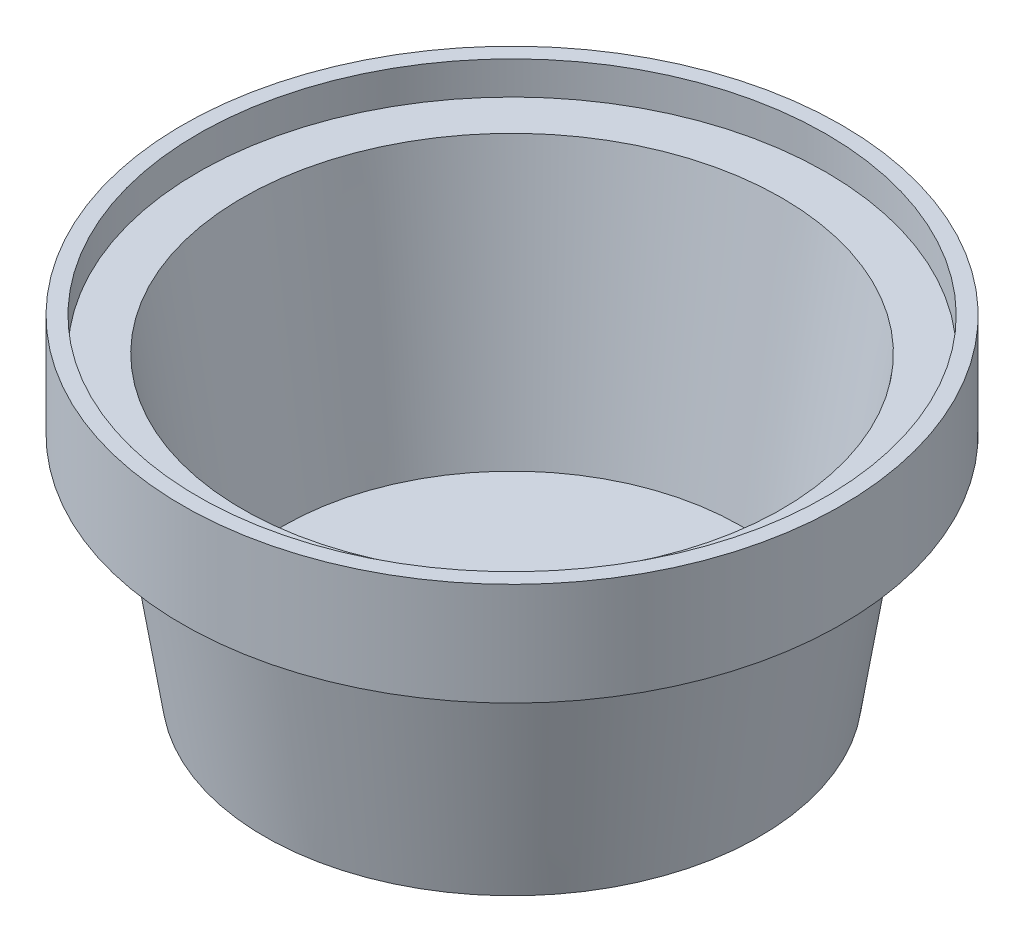
ISO-10303-21;
HEADER;
FILE_DESCRIPTION(('STEP AP214'),'2;1');
FILE_NAME('part.step','',(''),(''),'','','');
FILE_SCHEMA(('AUTOMOTIVE_DESIGN { 1 0 10303 214 1 1 1 1 }'));
ENDSEC;
DATA;
#1=APPLICATION_CONTEXT('core data for automotive mechanical design processes');
#2=APPLICATION_PROTOCOL_DEFINITION('international standard','automotive_design',2000,#1);
#3=PRODUCT_CONTEXT('',#1,'mechanical');
#4=PRODUCT('Part','Part','',(#3));
#5=PRODUCT_RELATED_PRODUCT_CATEGORY('part','',(#4));
#6=PRODUCT_DEFINITION_FORMATION('','',#4);
#7=PRODUCT_DEFINITION_CONTEXT('part definition',#1,'design');
#8=PRODUCT_DEFINITION('design','',#6,#7);
#9=PRODUCT_DEFINITION_SHAPE('','',#8);
#10=(LENGTH_UNIT() NAMED_UNIT(*) SI_UNIT(.MILLI.,.METRE.));
#11=(NAMED_UNIT(*) PLANE_ANGLE_UNIT() SI_UNIT($,.RADIAN.));
#12=(NAMED_UNIT(*) SI_UNIT($,.STERADIAN.) SOLID_ANGLE_UNIT());
#13=UNCERTAINTY_MEASURE_WITH_UNIT(LENGTH_MEASURE(1.E-05),#10,'distance_accuracy_value','');
#14=(GEOMETRIC_REPRESENTATION_CONTEXT(3) GLOBAL_UNCERTAINTY_ASSIGNED_CONTEXT((#13)) GLOBAL_UNIT_ASSIGNED_CONTEXT((#10,
#11,#12)) REPRESENTATION_CONTEXT('',''));
#15=CARTESIAN_POINT('',(0.,0.,0.));
#16=DIRECTION('',(0.,0.,1.));
#17=DIRECTION('',(1.,0.,0.));
#18=AXIS2_PLACEMENT_3D('',#15,#16,#17);
#19=CARTESIAN_POINT('',(0.,-0.752989309522639,0.));
#20=DIRECTION('',(0.,-1.,0.));
#21=DIRECTION('',(0.,0.,-1.));
#22=AXIS2_PLACEMENT_3D('',#19,#20,#21);
#23=PLANE('',#22);
#24=CARTESIAN_POINT('',(-12.89685,-0.752989309522639,0.));
#25=DIRECTION('',(0.,1.,0.));
#26=DIRECTION('',(0.,0.,1.));
#27=AXIS2_PLACEMENT_3D('',#24,#25,#26);
#28=CIRCLE('',#27,8.001);
#29=CARTESIAN_POINT('',(-12.89685,-0.752989309522639,8.001));
#30=VERTEX_POINT('',#29);
#31=EDGE_CURVE('E67',#30,#30,#28,.T.);
#32=ORIENTED_EDGE('',*,*,#31,.T.);
#33=EDGE_LOOP('',(#32));
#34=FACE_BOUND('',#33,.T.);
#35=CARTESIAN_POINT('',(12.89685,-0.752989309522639,0.));
#36=DIRECTION('',(0.,1.,0.));
#37=DIRECTION('',(0.,0.,1.));
#38=AXIS2_PLACEMENT_3D('',#35,#36,#37);
#39=CIRCLE('',#38,8.001);
#40=CARTESIAN_POINT('',(12.89685,-0.752989309522639,8.00100000000001));
#41=VERTEX_POINT('',#40);
#42=EDGE_CURVE('E77',#41,#41,#39,.T.);
#43=ORIENTED_EDGE('',*,*,#42,.T.);
#44=EDGE_LOOP('',(#43));
#45=FACE_BOUND('',#44,.T.);
#46=CARTESIAN_POINT('',(0.,-0.752989309522639,29.9688760415009));
#47=DIRECTION('',(0.,1.,0.));
#48=DIRECTION('',(0.,0.,1.));
#49=AXIS2_PLACEMENT_3D('',#46,#47,#48);
#50=CIRCLE('',#49,2.2225);
#51=CARTESIAN_POINT('',(0.,-0.752989309522639,32.1913760415009));
#52=VERTEX_POINT('',#51);
#53=EDGE_CURVE('E71',#52,#52,#50,.T.);
#54=ORIENTED_EDGE('',*,*,#53,.T.);
#55=EDGE_LOOP('',(#54));
#56=FACE_BOUND('',#55,.T.);
#57=CARTESIAN_POINT('',(0.,-0.752989309522639,0.));
#58=DIRECTION('',(0.,-1.,0.));
#59=DIRECTION('',(0.,0.,-1.));
#60=AXIS2_PLACEMENT_3D('',#57,#58,#59);
#61=CIRCLE('',#60,40.5325174906559);
#62=CARTESIAN_POINT('',(0.,-0.752989309522639,-40.5325174906559));
#63=VERTEX_POINT('',#62);
#64=EDGE_CURVE('E10',#63,#63,#61,.T.);
#65=ORIENTED_EDGE('',*,*,#64,.T.);
#66=EDGE_LOOP('',(#65));
#67=FACE_BOUND('',#66,.T.);
#68=ADVANCED_FACE('F30',(#34,#45,#56,#67),#23,.T.);
#69=CARTESIAN_POINT('',(0.,-0.752989309522639,0.));
#70=DIRECTION('',(0.,1.,0.));
#71=DIRECTION('',(0.,0.,1.));
#72=AXIS2_PLACEMENT_3D('',#69,#70,#71);
#73=CONICAL_SURFACE('',#72,40.5325174906559,0.153901942855348);
#74=CARTESIAN_POINT('',(0.,44.9670106904774,0.));
#75=DIRECTION('',(0.,-1.,0.));
#76=DIRECTION('',(0.,0.,-1.));
#77=AXIS2_PLACEMENT_3D('',#74,#75,#76);
#78=CIRCLE('',#77,47.625);
#79=CARTESIAN_POINT('',(0.,44.9670106904774,-47.625));
#80=VERTEX_POINT('',#79);
#81=EDGE_CURVE('E36',#80,#80,#78,.T.);
#82=ORIENTED_EDGE('',*,*,#81,.T.);
#83=EDGE_LOOP('',(#82));
#84=FACE_BOUND('',#83,.T.);
#85=ORIENTED_EDGE('',*,*,#64,.F.);
#86=EDGE_LOOP('',(#85));
#87=FACE_BOUND('',#86,.T.);
#88=ADVANCED_FACE('F151',(#84,#87),#73,.T.);
#89=CARTESIAN_POINT('',(47.625,44.9670106904774,0.));
#90=DIRECTION('',(0.,-1.,0.));
#91=DIRECTION('',(0.,0.,-1.));
#92=AXIS2_PLACEMENT_3D('',#89,#90,#91);
#93=PLANE('',#92);
#94=CARTESIAN_POINT('',(0.,44.9670106904774,0.));
#95=DIRECTION('',(0.,-1.,0.));
#96=DIRECTION('',(0.,0.,-1.));
#97=AXIS2_PLACEMENT_3D('',#94,#95,#96);
#98=CIRCLE('',#97,51.435);
#99=CARTESIAN_POINT('',(0.,44.9670106904774,-51.435));
#100=VERTEX_POINT('',#99);
#101=EDGE_CURVE('E40',#100,#100,#98,.T.);
#102=ORIENTED_EDGE('',*,*,#101,.T.);
#103=EDGE_LOOP('',(#102));
#104=FACE_BOUND('',#103,.T.);
#105=ORIENTED_EDGE('',*,*,#81,.F.);
#106=EDGE_LOOP('',(#105));
#107=FACE_BOUND('',#106,.T.);
#108=ADVANCED_FACE('F145',(#104,#107),#93,.T.);
#109=CARTESIAN_POINT('',(0.,0.,0.));
#110=DIRECTION('',(0.,-1.,0.));
#111=DIRECTION('',(0.,0.,-1.));
#112=AXIS2_PLACEMENT_3D('',#109,#110,#111);
#113=CYLINDRICAL_SURFACE('',#112,51.435);
#114=CARTESIAN_POINT('',(0.,36.0770106904774,0.));
#115=DIRECTION('',(0.,-1.,0.));
#116=DIRECTION('',(0.,0.,-1.));
#117=AXIS2_PLACEMENT_3D('',#114,#115,#116);
#118=CIRCLE('',#117,51.435);
#119=CARTESIAN_POINT('',(0.,36.0770106904774,-51.435));
#120=VERTEX_POINT('',#119);
#121=EDGE_CURVE('E44',#120,#120,#118,.T.);
#122=ORIENTED_EDGE('',*,*,#121,.T.);
#123=EDGE_LOOP('',(#122));
#124=FACE_BOUND('',#123,.T.);
#125=ORIENTED_EDGE('',*,*,#101,.F.);
#126=EDGE_LOOP('',(#125));
#127=FACE_BOUND('',#126,.T.);
#128=ADVANCED_FACE('F139',(#124,#127),#113,.F.);
#129=CARTESIAN_POINT('',(53.975,36.0770106904774,0.));
#130=DIRECTION('',(0.,-1.,0.));
#131=DIRECTION('',(0.,0.,-1.));
#132=AXIS2_PLACEMENT_3D('',#129,#130,#131);
#133=PLANE('',#132);
#134=CARTESIAN_POINT('',(0.,36.0770106904774,0.));
#135=DIRECTION('',(0.,-1.,0.));
#136=DIRECTION('',(0.,0.,-1.));
#137=AXIS2_PLACEMENT_3D('',#134,#135,#136);
#138=CIRCLE('',#137,53.975);
#139=CARTESIAN_POINT('',(0.,36.0770106904774,-53.975));
#140=VERTEX_POINT('',#139);
#141=EDGE_CURVE('E49',#140,#140,#138,.T.);
#142=ORIENTED_EDGE('',*,*,#141,.T.);
#143=EDGE_LOOP('',(#142));
#144=FACE_BOUND('',#143,.T.);
#145=ORIENTED_EDGE('',*,*,#121,.F.);
#146=EDGE_LOOP('',(#145));
#147=FACE_BOUND('',#146,.T.);
#148=ADVANCED_FACE('F133',(#144,#147),#133,.T.);
#149=CARTESIAN_POINT('',(0.,0.,0.));
#150=DIRECTION('',(0.,-1.,0.));
#151=DIRECTION('',(0.,0.,-1.));
#152=AXIS2_PLACEMENT_3D('',#149,#150,#151);
#153=CYLINDRICAL_SURFACE('',#152,53.975);
#154=CARTESIAN_POINT('',(0.,52.9240598516609,0.));
#155=DIRECTION('',(0.,-1.,0.));
#156=DIRECTION('',(0.,0.,-1.));
#157=AXIS2_PLACEMENT_3D('',#154,#155,#156);
#158=CIRCLE('',#157,53.975);
#159=CARTESIAN_POINT('',(0.,52.9240598516609,-53.975));
#160=VERTEX_POINT('',#159);
#161=EDGE_CURVE('E52',#160,#160,#158,.T.);
#162=ORIENTED_EDGE('',*,*,#161,.T.);
#163=EDGE_LOOP('',(#162));
#164=FACE_BOUND('',#163,.T.);
#165=ORIENTED_EDGE('',*,*,#141,.F.);
#166=EDGE_LOOP('',(#165));
#167=FACE_BOUND('',#166,.T.);
#168=ADVANCED_FACE('F127',(#164,#167),#153,.T.);
#169=CARTESIAN_POINT('',(53.975,52.9240598516609,0.));
#170=DIRECTION('',(0.,1.,0.));
#171=DIRECTION('',(0.,0.,1.));
#172=AXIS2_PLACEMENT_3D('',#169,#170,#171);
#173=PLANE('',#172);
#174=CARTESIAN_POINT('',(0.,52.9240598516609,0.));
#175=DIRECTION('',(0.,-1.,0.));
#176=DIRECTION('',(0.,0.,-1.));
#177=AXIS2_PLACEMENT_3D('',#174,#175,#176);
#178=CIRCLE('',#177,51.435);
#179=CARTESIAN_POINT('',(0.,52.9240598516609,-51.435));
#180=VERTEX_POINT('',#179);
#181=EDGE_CURVE('E55',#180,#180,#178,.T.);
#182=ORIENTED_EDGE('',*,*,#181,.T.);
#183=EDGE_LOOP('',(#182));
#184=FACE_BOUND('',#183,.T.);
#185=ORIENTED_EDGE('',*,*,#161,.F.);
#186=EDGE_LOOP('',(#185));
#187=FACE_BOUND('',#186,.T.);
#188=ADVANCED_FACE('F121',(#184,#187),#173,.T.);
#189=CARTESIAN_POINT('',(0.,0.,0.));
#190=DIRECTION('',(0.,-1.,0.));
#191=DIRECTION('',(0.,0.,-1.));
#192=AXIS2_PLACEMENT_3D('',#189,#190,#191);
#193=CYLINDRICAL_SURFACE('',#192,51.435);
#194=CARTESIAN_POINT('',(0.,47.5070106904774,0.));
#195=DIRECTION('',(0.,-1.,0.));
#196=DIRECTION('',(0.,0.,-1.));
#197=AXIS2_PLACEMENT_3D('',#194,#195,#196);
#198=CIRCLE('',#197,51.435);
#199=CARTESIAN_POINT('',(0.,47.5070106904774,-51.435));
#200=VERTEX_POINT('',#199);
#201=EDGE_CURVE('E58',#200,#200,#198,.T.);
#202=ORIENTED_EDGE('',*,*,#201,.T.);
#203=EDGE_LOOP('',(#202));
#204=FACE_BOUND('',#203,.T.);
#205=ORIENTED_EDGE('',*,*,#181,.F.);
#206=EDGE_LOOP('',(#205));
#207=FACE_BOUND('',#206,.T.);
#208=ADVANCED_FACE('F115',(#204,#207),#193,.F.);
#209=CARTESIAN_POINT('',(44.1634557032694,47.5070106904774,0.));
#210=DIRECTION('',(0.,1.,0.));
#211=DIRECTION('',(0.,0.,1.));
#212=AXIS2_PLACEMENT_3D('',#209,#210,#211);
#213=PLANE('',#212);
#214=CARTESIAN_POINT('',(0.,47.5070106904774,0.));
#215=DIRECTION('',(0.,-1.,0.));
#216=DIRECTION('',(0.,0.,-1.));
#217=AXIS2_PLACEMENT_3D('',#214,#215,#216);
#218=CIRCLE('',#217,44.1634557032694);
#219=CARTESIAN_POINT('',(0.,47.5070106904774,-44.1634557032694));
#220=VERTEX_POINT('',#219);
#221=EDGE_CURVE('E61',#220,#220,#218,.T.);
#222=ORIENTED_EDGE('',*,*,#221,.T.);
#223=EDGE_LOOP('',(#222));
#224=FACE_BOUND('',#223,.T.);
#225=ORIENTED_EDGE('',*,*,#201,.F.);
#226=EDGE_LOOP('',(#225));
#227=FACE_BOUND('',#226,.T.);
#228=ADVANCED_FACE('F109',(#224,#227),#213,.T.);
#229=CARTESIAN_POINT('',(0.,47.5070106904774,0.));
#230=DIRECTION('',(0.,1.,0.));
#231=DIRECTION('',(0.,0.,1.));
#232=AXIS2_PLACEMENT_3D('',#229,#230,#231);
#233=CONICAL_SURFACE('',#232,44.1634557032694,0.153901942855348);
#234=CARTESIAN_POINT('',(0.,4.32701069047736,0.));
#235=DIRECTION('',(0.,-1.,0.));
#236=DIRECTION('',(0.,0.,-1.));
#237=AXIS2_PLACEMENT_3D('',#234,#235,#236);
#238=CIRCLE('',#237,37.465);
#239=CARTESIAN_POINT('',(0.,4.32701069047736,-37.465));
#240=VERTEX_POINT('',#239);
#241=EDGE_CURVE('E64',#240,#240,#238,.T.);
#242=ORIENTED_EDGE('',*,*,#241,.T.);
#243=EDGE_LOOP('',(#242));
#244=FACE_BOUND('',#243,.T.);
#245=ORIENTED_EDGE('',*,*,#221,.F.);
#246=EDGE_LOOP('',(#245));
#247=FACE_BOUND('',#246,.T.);
#248=ADVANCED_FACE('F99',(#244,#247),#233,.F.);
#249=CARTESIAN_POINT('',(0.,4.32701069047736,0.));
#250=DIRECTION('',(0.,1.,0.));
#251=DIRECTION('',(0.,0.,1.));
#252=AXIS2_PLACEMENT_3D('',#249,#250,#251);
#253=PLANE('',#252);
#254=CARTESIAN_POINT('',(-12.89685,4.32701069047736,0.));
#255=DIRECTION('',(0.,1.,0.));
#256=DIRECTION('',(0.,0.,1.));
#257=AXIS2_PLACEMENT_3D('',#254,#255,#256);
#258=CIRCLE('',#257,8.001);
#259=CARTESIAN_POINT('',(-12.89685,4.32701069047736,8.001));
#260=VERTEX_POINT('',#259);
#261=EDGE_CURVE('E80',#260,#260,#258,.T.);
#262=ORIENTED_EDGE('',*,*,#261,.F.);
#263=EDGE_LOOP('',(#262));
#264=FACE_BOUND('',#263,.T.);
#265=CARTESIAN_POINT('',(12.89685,4.32701069047736,0.));
#266=DIRECTION('',(0.,1.,0.));
#267=DIRECTION('',(0.,0.,1.));
#268=AXIS2_PLACEMENT_3D('',#265,#266,#267);
#269=CIRCLE('',#268,8.001);
#270=CARTESIAN_POINT('',(12.89685,4.32701069047736,8.00100000000001));
#271=VERTEX_POINT('',#270);
#272=EDGE_CURVE('E74',#271,#271,#269,.T.);
#273=ORIENTED_EDGE('',*,*,#272,.F.);
#274=EDGE_LOOP('',(#273));
#275=FACE_BOUND('',#274,.T.);
#276=CARTESIAN_POINT('',(0.,4.32701069047736,29.9688760415009));
#277=DIRECTION('',(0.,1.,0.));
#278=DIRECTION('',(0.,0.,1.));
#279=AXIS2_PLACEMENT_3D('',#276,#277,#278);
#280=CIRCLE('',#279,2.2225);
#281=CARTESIAN_POINT('',(0.,4.32701069047736,32.1913760415009));
#282=VERTEX_POINT('',#281);
#283=EDGE_CURVE('E68',#282,#282,#280,.T.);
#284=ORIENTED_EDGE('',*,*,#283,.F.);
#285=EDGE_LOOP('',(#284));
#286=FACE_BOUND('',#285,.T.);
#287=ORIENTED_EDGE('',*,*,#241,.F.);
#288=EDGE_LOOP('',(#287));
#289=FACE_BOUND('',#288,.T.);
#290=ADVANCED_FACE('F95',(#264,#275,#286,#289),#253,.T.);
#291=CARTESIAN_POINT('',(0.,-0.752989309522639,29.9688760415009));
#292=DIRECTION('',(0.,1.,0.));
#293=DIRECTION('',(0.,0.,1.));
#294=AXIS2_PLACEMENT_3D('',#291,#292,#293);
#295=CYLINDRICAL_SURFACE('',#294,2.2225);
#296=ORIENTED_EDGE('',*,*,#53,.F.);
#297=EDGE_LOOP('',(#296));
#298=FACE_BOUND('',#297,.T.);
#299=ORIENTED_EDGE('',*,*,#283,.T.);
#300=EDGE_LOOP('',(#299));
#301=FACE_BOUND('',#300,.T.);
#302=ADVANCED_FACE('F98',(#298,#301),#295,.F.);
#303=CARTESIAN_POINT('',(12.89685,-0.752989309522639,0.));
#304=DIRECTION('',(0.,1.,0.));
#305=DIRECTION('',(0.,0.,1.));
#306=AXIS2_PLACEMENT_3D('',#303,#304,#305);
#307=CYLINDRICAL_SURFACE('',#306,8.001);
#308=ORIENTED_EDGE('',*,*,#42,.F.);
#309=EDGE_LOOP('',(#308));
#310=FACE_BOUND('',#309,.T.);
#311=ORIENTED_EDGE('',*,*,#272,.T.);
#312=EDGE_LOOP('',(#311));
#313=FACE_BOUND('',#312,.T.);
#314=ADVANCED_FACE('F91',(#310,#313),#307,.F.);
#315=CARTESIAN_POINT('',(-12.89685,-0.752989309522639,0.));
#316=DIRECTION('',(0.,1.,0.));
#317=DIRECTION('',(0.,0.,1.));
#318=AXIS2_PLACEMENT_3D('',#315,#316,#317);
#319=CYLINDRICAL_SURFACE('',#318,8.001);
#320=ORIENTED_EDGE('',*,*,#31,.F.);
#321=EDGE_LOOP('',(#320));
#322=FACE_BOUND('',#321,.T.);
#323=ORIENTED_EDGE('',*,*,#261,.T.);
#324=EDGE_LOOP('',(#323));
#325=FACE_BOUND('',#324,.T.);
#326=ADVANCED_FACE('F88',(#322,#325),#319,.F.);
#327=CLOSED_SHELL('',(#68,#88,#108,#128,#148,#168,#188,#208,#228,#248,#290,#302,#314,#326));
#328=MANIFOLD_SOLID_BREP('B2',#327);
#329=ADVANCED_BREP_SHAPE_REPRESENTATION('',(#18,#328),#14);
#330=SHAPE_DEFINITION_REPRESENTATION(#9,#329);
ENDSEC;
END-ISO-10303-21;
